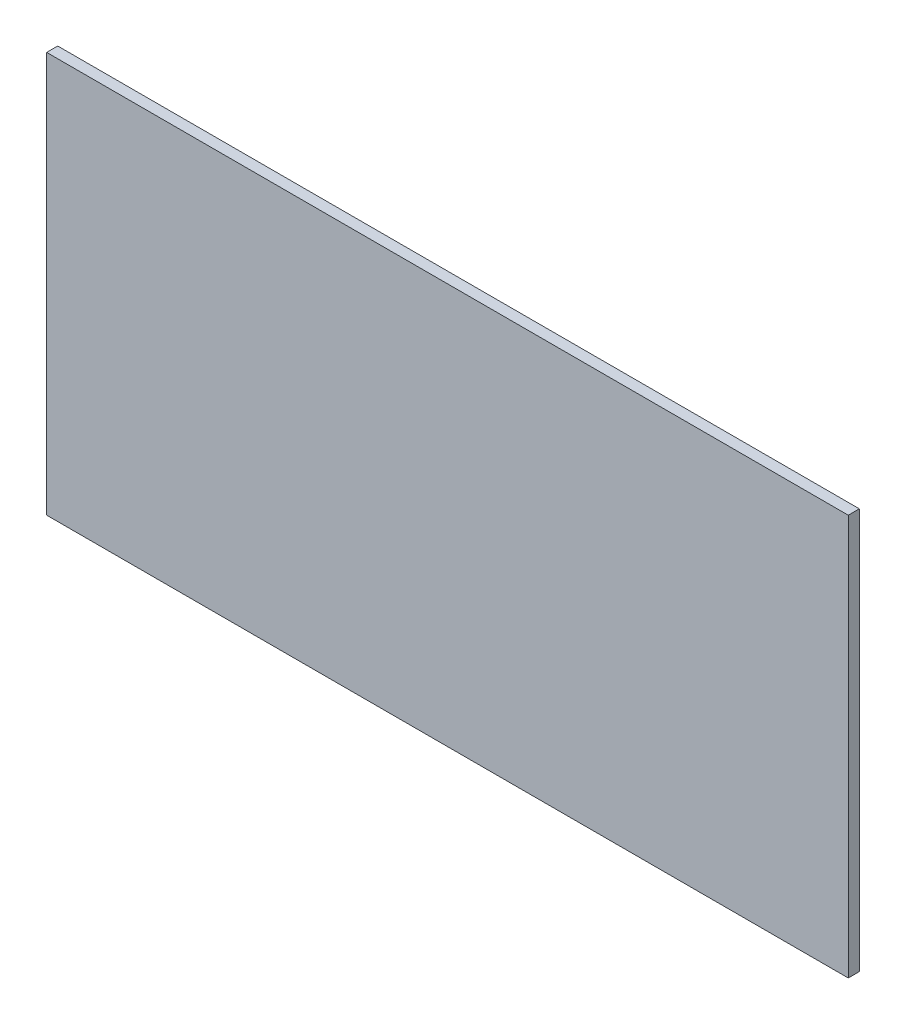
ISO-10303-21;
HEADER;
FILE_DESCRIPTION(('STEP AP214'),'2;1');
FILE_NAME('part.step','',(''),(''),'','','');
FILE_SCHEMA(('AUTOMOTIVE_DESIGN { 1 0 10303 214 1 1 1 1 }'));
ENDSEC;
DATA;
#1=APPLICATION_CONTEXT('core data for automotive mechanical design processes');
#2=APPLICATION_PROTOCOL_DEFINITION('international standard','automotive_design',2000,#1);
#3=PRODUCT_CONTEXT('',#1,'mechanical');
#4=PRODUCT('Part','Part','',(#3));
#5=PRODUCT_RELATED_PRODUCT_CATEGORY('part','',(#4));
#6=PRODUCT_DEFINITION_FORMATION('','',#4);
#7=PRODUCT_DEFINITION_CONTEXT('part definition',#1,'design');
#8=PRODUCT_DEFINITION('design','',#6,#7);
#9=PRODUCT_DEFINITION_SHAPE('','',#8);
#10=(LENGTH_UNIT() NAMED_UNIT(*) SI_UNIT(.MILLI.,.METRE.));
#11=(NAMED_UNIT(*) PLANE_ANGLE_UNIT() SI_UNIT($,.RADIAN.));
#12=(NAMED_UNIT(*) SI_UNIT($,.STERADIAN.) SOLID_ANGLE_UNIT());
#13=UNCERTAINTY_MEASURE_WITH_UNIT(LENGTH_MEASURE(1.E-05),#10,'distance_accuracy_value','');
#14=(GEOMETRIC_REPRESENTATION_CONTEXT(3) GLOBAL_UNCERTAINTY_ASSIGNED_CONTEXT((#13)) GLOBAL_UNIT_ASSIGNED_CONTEXT((#10,
#11,#12)) REPRESENTATION_CONTEXT('',''));
#15=CARTESIAN_POINT('',(0.,0.,0.));
#16=DIRECTION('',(0.,0.,1.));
#17=DIRECTION('',(1.,0.,0.));
#18=AXIS2_PLACEMENT_3D('',#15,#16,#17);
#19=CARTESIAN_POINT('',(-460.,-230.,12.7));
#20=DIRECTION('',(1.,0.,0.));
#21=DIRECTION('',(0.,0.,-1.));
#22=AXIS2_PLACEMENT_3D('',#19,#20,#21);
#23=PLANE('',#22);
#24=DIRECTION('',(0.,-1.,0.));
#25=VECTOR('',#24,1.);
#26=CARTESIAN_POINT('',(-460.,-230.,0.));
#27=LINE('',#26,#25);
#28=CARTESIAN_POINT('',(-460.,230.,0.));
#29=VERTEX_POINT('',#28);
#30=CARTESIAN_POINT('',(-460.,-230.,0.));
#31=VERTEX_POINT('',#30);
#32=EDGE_CURVE('E96',#29,#31,#27,.T.);
#33=ORIENTED_EDGE('',*,*,#32,.T.);
#34=DIRECTION('',(0.,0.,-1.));
#35=VECTOR('',#34,1.);
#36=CARTESIAN_POINT('',(-460.,-230.,12.7));
#37=LINE('',#36,#35);
#38=CARTESIAN_POINT('',(-460.,-230.,12.7));
#39=VERTEX_POINT('',#38);
#40=EDGE_CURVE('E11',#39,#31,#37,.T.);
#41=ORIENTED_EDGE('',*,*,#40,.F.);
#42=DIRECTION('',(0.,-1.,0.));
#43=VECTOR('',#42,1.);
#44=CARTESIAN_POINT('',(-460.,-230.,12.7));
#45=LINE('',#44,#43);
#46=CARTESIAN_POINT('',(-460.,230.,12.7));
#47=VERTEX_POINT('',#46);
#48=EDGE_CURVE('E84',#47,#39,#45,.T.);
#49=ORIENTED_EDGE('',*,*,#48,.F.);
#50=DIRECTION('',(0.,0.,-1.));
#51=VECTOR('',#50,1.);
#52=CARTESIAN_POINT('',(-460.,230.,12.7));
#53=LINE('',#52,#51);
#54=EDGE_CURVE('E92',#47,#29,#53,.T.);
#55=ORIENTED_EDGE('',*,*,#54,.T.);
#56=EDGE_LOOP('',(#33,#41,#49,#55));
#57=FACE_BOUND('',#56,.T.);
#58=ADVANCED_FACE('F33',(#57),#23,.F.);
#59=CARTESIAN_POINT('',(460.,-230.,12.7));
#60=DIRECTION('',(0.,1.,0.));
#61=DIRECTION('',(-1.,0.,0.));
#62=AXIS2_PLACEMENT_3D('',#59,#60,#61);
#63=PLANE('',#62);
#64=DIRECTION('',(1.,0.,0.));
#65=VECTOR('',#64,1.);
#66=CARTESIAN_POINT('',(460.,-230.,0.));
#67=LINE('',#66,#65);
#68=CARTESIAN_POINT('',(460.,-230.,0.));
#69=VERTEX_POINT('',#68);
#70=EDGE_CURVE('E88',#31,#69,#67,.T.);
#71=ORIENTED_EDGE('',*,*,#70,.T.);
#72=DIRECTION('',(0.,0.,-1.));
#73=VECTOR('',#72,1.);
#74=CARTESIAN_POINT('',(460.,-230.,12.7));
#75=LINE('',#74,#73);
#76=CARTESIAN_POINT('',(460.,-230.,12.7));
#77=VERTEX_POINT('',#76);
#78=EDGE_CURVE('E41',#77,#69,#75,.T.);
#79=ORIENTED_EDGE('',*,*,#78,.F.);
#80=DIRECTION('',(1.,0.,0.));
#81=VECTOR('',#80,1.);
#82=CARTESIAN_POINT('',(460.,-230.,12.7));
#83=LINE('',#82,#81);
#84=EDGE_CURVE('E79',#39,#77,#83,.T.);
#85=ORIENTED_EDGE('',*,*,#84,.F.);
#86=ORIENTED_EDGE('',*,*,#40,.T.);
#87=EDGE_LOOP('',(#71,#79,#85,#86));
#88=FACE_BOUND('',#87,.T.);
#89=ADVANCED_FACE('F87',(#88),#63,.F.);
#90=CARTESIAN_POINT('',(460.,-230.,12.7));
#91=DIRECTION('',(-1.,0.,0.));
#92=DIRECTION('',(0.,-1.,0.));
#93=AXIS2_PLACEMENT_3D('',#90,#91,#92);
#94=PLANE('',#93);
#95=DIRECTION('',(0.,1.,0.));
#96=VECTOR('',#95,1.);
#97=CARTESIAN_POINT('',(460.,-230.,0.));
#98=LINE('',#97,#96);
#99=CARTESIAN_POINT('',(460.,230.,0.));
#100=VERTEX_POINT('',#99);
#101=EDGE_CURVE('E66',#69,#100,#98,.T.);
#102=ORIENTED_EDGE('',*,*,#101,.T.);
#103=DIRECTION('',(0.,0.,-1.));
#104=VECTOR('',#103,1.);
#105=CARTESIAN_POINT('',(460.,230.,12.7));
#106=LINE('',#105,#104);
#107=CARTESIAN_POINT('',(460.,230.,12.7));
#108=VERTEX_POINT('',#107);
#109=EDGE_CURVE('E89',#108,#100,#106,.T.);
#110=ORIENTED_EDGE('',*,*,#109,.F.);
#111=DIRECTION('',(0.,1.,0.));
#112=VECTOR('',#111,1.);
#113=CARTESIAN_POINT('',(460.,-230.,12.7));
#114=LINE('',#113,#112);
#115=EDGE_CURVE('E82',#77,#108,#114,.T.);
#116=ORIENTED_EDGE('',*,*,#115,.F.);
#117=ORIENTED_EDGE('',*,*,#78,.T.);
#118=EDGE_LOOP('',(#102,#110,#116,#117));
#119=FACE_BOUND('',#118,.T.);
#120=ADVANCED_FACE('F90',(#119),#94,.F.);
#121=CARTESIAN_POINT('',(460.,230.,12.7));
#122=DIRECTION('',(0.,-1.,0.));
#123=DIRECTION('',(1.,0.,0.));
#124=AXIS2_PLACEMENT_3D('',#121,#122,#123);
#125=PLANE('',#124);
#126=DIRECTION('',(-1.,0.,0.));
#127=VECTOR('',#126,1.);
#128=CARTESIAN_POINT('',(460.,230.,0.));
#129=LINE('',#128,#127);
#130=EDGE_CURVE('E72',#100,#29,#129,.T.);
#131=ORIENTED_EDGE('',*,*,#130,.T.);
#132=ORIENTED_EDGE('',*,*,#54,.F.);
#133=DIRECTION('',(-1.,0.,0.));
#134=VECTOR('',#133,1.);
#135=CARTESIAN_POINT('',(460.,230.,12.7));
#136=LINE('',#135,#134);
#137=EDGE_CURVE('E49',#108,#47,#136,.T.);
#138=ORIENTED_EDGE('',*,*,#137,.F.);
#139=ORIENTED_EDGE('',*,*,#109,.T.);
#140=EDGE_LOOP('',(#131,#132,#138,#139));
#141=FACE_BOUND('',#140,.T.);
#142=ADVANCED_FACE('F103',(#141),#125,.F.);
#143=CARTESIAN_POINT('',(0.,0.,12.7));
#144=DIRECTION('',(0.,0.,1.));
#145=DIRECTION('',(1.,0.,0.));
#146=AXIS2_PLACEMENT_3D('',#143,#144,#145);
#147=PLANE('',#146);
#148=ORIENTED_EDGE('',*,*,#48,.T.);
#149=ORIENTED_EDGE('',*,*,#84,.T.);
#150=ORIENTED_EDGE('',*,*,#115,.T.);
#151=ORIENTED_EDGE('',*,*,#137,.T.);
#152=EDGE_LOOP('',(#148,#149,#150,#151));
#153=FACE_BOUND('',#152,.T.);
#154=ADVANCED_FACE('F80',(#153),#147,.T.);
#155=CARTESIAN_POINT('',(0.,0.,0.));
#156=DIRECTION('',(0.,0.,1.));
#157=DIRECTION('',(1.,0.,0.));
#158=AXIS2_PLACEMENT_3D('',#155,#156,#157);
#159=PLANE('',#158);
#160=ORIENTED_EDGE('',*,*,#32,.F.);
#161=ORIENTED_EDGE('',*,*,#130,.F.);
#162=ORIENTED_EDGE('',*,*,#101,.F.);
#163=ORIENTED_EDGE('',*,*,#70,.F.);
#164=EDGE_LOOP('',(#160,#161,#162,#163));
#165=FACE_BOUND('',#164,.T.);
#166=ADVANCED_FACE('F106',(#165),#159,.F.);
#167=CLOSED_SHELL('',(#58,#89,#120,#142,#154,#166));
#168=MANIFOLD_SOLID_BREP('B2',#167);
#169=ADVANCED_BREP_SHAPE_REPRESENTATION('',(#18,#168),#14);
#170=SHAPE_DEFINITION_REPRESENTATION(#9,#169);
ENDSEC;
END-ISO-10303-21;
